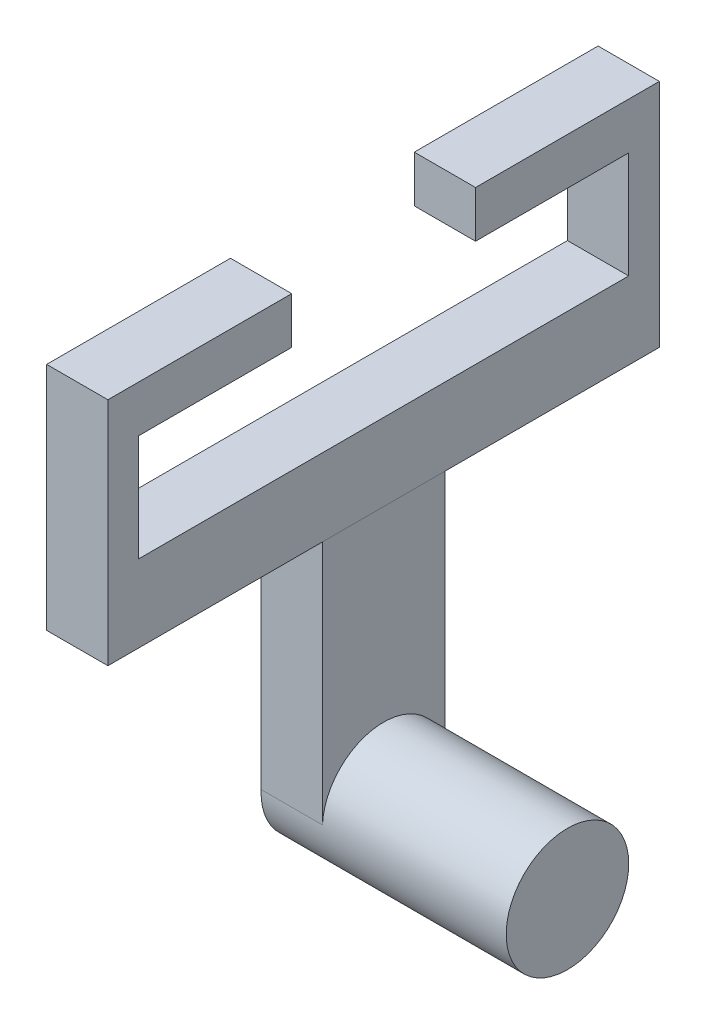
ISO-10303-21;
HEADER;
FILE_DESCRIPTION(('STEP AP214'),'2;1');
FILE_NAME('part.step','',(''),(''),'','','');
FILE_SCHEMA(('AUTOMOTIVE_DESIGN { 1 0 10303 214 1 1 1 1 }'));
ENDSEC;
DATA;
#1=APPLICATION_CONTEXT('core data for automotive mechanical design processes');
#2=APPLICATION_PROTOCOL_DEFINITION('international standard','automotive_design',2000,#1);
#3=PRODUCT_CONTEXT('',#1,'mechanical');
#4=PRODUCT('Part','Part','',(#3));
#5=PRODUCT_RELATED_PRODUCT_CATEGORY('part','',(#4));
#6=PRODUCT_DEFINITION_FORMATION('','',#4);
#7=PRODUCT_DEFINITION_CONTEXT('part definition',#1,'design');
#8=PRODUCT_DEFINITION('design','',#6,#7);
#9=PRODUCT_DEFINITION_SHAPE('','',#8);
#10=(LENGTH_UNIT() NAMED_UNIT(*) SI_UNIT(.MILLI.,.METRE.));
#11=(NAMED_UNIT(*) PLANE_ANGLE_UNIT() SI_UNIT($,.RADIAN.));
#12=(NAMED_UNIT(*) SI_UNIT($,.STERADIAN.) SOLID_ANGLE_UNIT());
#13=UNCERTAINTY_MEASURE_WITH_UNIT(LENGTH_MEASURE(1.E-05),#10,'distance_accuracy_value','');
#14=(GEOMETRIC_REPRESENTATION_CONTEXT(3) GLOBAL_UNCERTAINTY_ASSIGNED_CONTEXT((#13)) GLOBAL_UNIT_ASSIGNED_CONTEXT((#10,
#11,#12)) REPRESENTATION_CONTEXT('',''));
#15=CARTESIAN_POINT('',(0.,0.,0.));
#16=DIRECTION('',(0.,0.,1.));
#17=DIRECTION('',(1.,0.,0.));
#18=AXIS2_PLACEMENT_3D('',#15,#16,#17);
#19=CARTESIAN_POINT('',(12.7,51.3912941545788,-50.8));
#20=DIRECTION('',(0.,1.,0.));
#21=DIRECTION('',(0.,0.,1.));
#22=AXIS2_PLACEMENT_3D('',#19,#20,#21);
#23=PLANE('',#22);
#24=DIRECTION('',(0.,0.,-1.));
#25=VECTOR('',#24,1.);
#26=CARTESIAN_POINT('',(0.,51.3912941545788,-50.8));
#27=LINE('',#26,#25);
#28=CARTESIAN_POINT('',(0.,51.3912941545788,57.15));
#29=VERTEX_POINT('',#28);
#30=CARTESIAN_POINT('',(0.,51.3912941545788,-57.15));
#31=VERTEX_POINT('',#30);
#32=EDGE_CURVE('E220',#29,#31,#27,.T.);
#33=ORIENTED_EDGE('',*,*,#32,.T.);
#34=DIRECTION('',(-1.,0.,0.));
#35=VECTOR('',#34,1.);
#36=CARTESIAN_POINT('',(12.7,51.3912941545788,-57.15));
#37=LINE('',#36,#35);
#38=CARTESIAN_POINT('',(12.7,51.3912941545788,-57.15));
#39=VERTEX_POINT('',#38);
#40=EDGE_CURVE('E163',#39,#31,#37,.T.);
#41=ORIENTED_EDGE('',*,*,#40,.F.);
#42=DIRECTION('',(0.,0.,-1.));
#43=VECTOR('',#42,1.);
#44=CARTESIAN_POINT('',(12.7,51.3912941545788,-50.8));
#45=LINE('',#44,#43);
#46=CARTESIAN_POINT('',(12.7,51.3912941545788,57.15));
#47=VERTEX_POINT('',#46);
#48=EDGE_CURVE('E229',#47,#39,#45,.T.);
#49=ORIENTED_EDGE('',*,*,#48,.F.);
#50=DIRECTION('',(-1.,0.,0.));
#51=VECTOR('',#50,1.);
#52=CARTESIAN_POINT('',(12.7,51.3912941545788,57.15));
#53=LINE('',#52,#51);
#54=EDGE_CURVE('E210',#47,#29,#53,.T.);
#55=ORIENTED_EDGE('',*,*,#54,.T.);
#56=EDGE_LOOP('',(#33,#41,#49,#55));
#57=FACE_BOUND('',#56,.T.);
#58=ADVANCED_FACE('F60',(#57),#23,.F.);
#59=CARTESIAN_POINT('',(12.7,67.3932941545788,-50.8));
#60=DIRECTION('',(0.,-1.,0.));
#61=DIRECTION('',(0.,0.,-1.));
#62=AXIS2_PLACEMENT_3D('',#59,#60,#61);
#63=PLANE('',#62);
#64=DIRECTION('',(0.,0.,1.));
#65=VECTOR('',#64,1.);
#66=CARTESIAN_POINT('',(0.,67.3932941545788,-50.8));
#67=LINE('',#66,#65);
#68=CARTESIAN_POINT('',(0.,67.3932941545788,-50.8));
#69=VERTEX_POINT('',#68);
#70=CARTESIAN_POINT('',(0.,67.3932941545788,50.8));
#71=VERTEX_POINT('',#70);
#72=EDGE_CURVE('E235',#69,#71,#67,.T.);
#73=ORIENTED_EDGE('',*,*,#72,.T.);
#74=DIRECTION('',(-1.,0.,0.));
#75=VECTOR('',#74,1.);
#76=CARTESIAN_POINT('',(12.7,67.3932941545788,50.8));
#77=LINE('',#76,#75);
#78=CARTESIAN_POINT('',(12.7,67.3932941545788,50.8));
#79=VERTEX_POINT('',#78);
#80=EDGE_CURVE('E64',#79,#71,#77,.T.);
#81=ORIENTED_EDGE('',*,*,#80,.F.);
#82=DIRECTION('',(0.,0.,1.));
#83=VECTOR('',#82,1.);
#84=CARTESIAN_POINT('',(12.7,67.3932941545788,-50.8));
#85=LINE('',#84,#83);
#86=CARTESIAN_POINT('',(12.7,67.3932941545788,-50.8));
#87=VERTEX_POINT('',#86);
#88=EDGE_CURVE('E71',#87,#79,#85,.T.);
#89=ORIENTED_EDGE('',*,*,#88,.F.);
#90=DIRECTION('',(-1.,0.,0.));
#91=VECTOR('',#90,1.);
#92=CARTESIAN_POINT('',(12.7,67.3932941545788,-50.8));
#93=LINE('',#92,#91);
#94=EDGE_CURVE('E12',#87,#69,#93,.T.);
#95=ORIENTED_EDGE('',*,*,#94,.T.);
#96=EDGE_LOOP('',(#73,#81,#89,#95));
#97=FACE_BOUND('',#96,.T.);
#98=ADVANCED_FACE('F271',(#97),#63,.F.);
#99=CARTESIAN_POINT('',(12.7,0.,0.));
#100=DIRECTION('',(-1.,0.,0.));
#101=DIRECTION('',(0.,0.,1.));
#102=AXIS2_PLACEMENT_3D('',#99,#100,#101);
#103=PLANE('',#102);
#104=ORIENTED_EDGE('',*,*,#88,.T.);
#105=DIRECTION('',(0.,1.,0.));
#106=VECTOR('',#105,1.);
#107=CARTESIAN_POINT('',(12.7,51.3912941545788,50.8));
#108=LINE('',#107,#106);
#109=CARTESIAN_POINT('',(12.7,89.4912941545788,50.8));
#110=VERTEX_POINT('',#109);
#111=EDGE_CURVE('E147',#79,#110,#108,.T.);
#112=ORIENTED_EDGE('',*,*,#111,.T.);
#113=DIRECTION('',(0.,0.,-1.));
#114=VECTOR('',#113,1.);
#115=CARTESIAN_POINT('',(12.7,89.4912941545788,57.15));
#116=LINE('',#115,#114);
#117=CARTESIAN_POINT('',(12.7,89.4912941545788,19.05));
#118=VERTEX_POINT('',#117);
#119=EDGE_CURVE('E139',#110,#118,#116,.T.);
#120=ORIENTED_EDGE('',*,*,#119,.T.);
#121=DIRECTION('',(0.,1.,0.));
#122=VECTOR('',#121,1.);
#123=CARTESIAN_POINT('',(12.7,89.4912941545788,19.05));
#124=LINE('',#123,#122);
#125=CARTESIAN_POINT('',(12.7,99.1432941545788,19.05));
#126=VERTEX_POINT('',#125);
#127=EDGE_CURVE('E143',#118,#126,#124,.T.);
#128=ORIENTED_EDGE('',*,*,#127,.T.);
#129=DIRECTION('',(0.,0.,1.));
#130=VECTOR('',#129,1.);
#131=CARTESIAN_POINT('',(12.7,99.1432941545788,57.15));
#132=LINE('',#131,#130);
#133=CARTESIAN_POINT('',(12.7,99.1432941545788,57.15));
#134=VERTEX_POINT('',#133);
#135=EDGE_CURVE('E170',#126,#134,#132,.T.);
#136=ORIENTED_EDGE('',*,*,#135,.T.);
#137=DIRECTION('',(0.,-1.,0.));
#138=VECTOR('',#137,1.);
#139=CARTESIAN_POINT('',(12.7,51.3912941545788,57.15));
#140=LINE('',#139,#138);
#141=EDGE_CURVE('E203',#134,#47,#140,.T.);
#142=ORIENTED_EDGE('',*,*,#141,.T.);
#143=ORIENTED_EDGE('',*,*,#48,.T.);
#144=DIRECTION('',(0.,1.,0.));
#145=VECTOR('',#144,1.);
#146=CARTESIAN_POINT('',(12.7,51.3912941545788,-57.15));
#147=LINE('',#146,#145);
#148=CARTESIAN_POINT('',(12.7,99.1432941545788,-57.15));
#149=VERTEX_POINT('',#148);
#150=EDGE_CURVE('E223',#39,#149,#147,.T.);
#151=ORIENTED_EDGE('',*,*,#150,.T.);
#152=DIRECTION('',(0.,0.,1.));
#153=VECTOR('',#152,1.);
#154=CARTESIAN_POINT('',(12.7,99.1432941545788,-57.15));
#155=LINE('',#154,#153);
#156=CARTESIAN_POINT('',(12.7,99.1432941545788,-19.05));
#157=VERTEX_POINT('',#156);
#158=EDGE_CURVE('E193',#149,#157,#155,.T.);
#159=ORIENTED_EDGE('',*,*,#158,.T.);
#160=DIRECTION('',(0.,-1.,0.));
#161=VECTOR('',#160,1.);
#162=CARTESIAN_POINT('',(12.7,89.4912941545788,-19.05));
#163=LINE('',#162,#161);
#164=CARTESIAN_POINT('',(12.7,89.4912941545788,-19.05));
#165=VERTEX_POINT('',#164);
#166=EDGE_CURVE('E199',#157,#165,#163,.T.);
#167=ORIENTED_EDGE('',*,*,#166,.T.);
#168=DIRECTION('',(0.,0.,-1.));
#169=VECTOR('',#168,1.);
#170=CARTESIAN_POINT('',(12.7,89.4912941545788,-57.15));
#171=LINE('',#170,#169);
#172=CARTESIAN_POINT('',(12.7,89.4912941545788,-50.8));
#173=VERTEX_POINT('',#172);
#174=EDGE_CURVE('E188',#165,#173,#171,.T.);
#175=ORIENTED_EDGE('',*,*,#174,.T.);
#176=DIRECTION('',(0.,-1.,0.));
#177=VECTOR('',#176,1.);
#178=CARTESIAN_POINT('',(12.7,51.3912941545788,-50.8));
#179=LINE('',#178,#177);
#180=EDGE_CURVE('E228',#173,#87,#179,.T.);
#181=ORIENTED_EDGE('',*,*,#180,.T.);
#182=EDGE_LOOP('',(#104,#112,#120,#128,#136,#142,#143,#151,#159,#167,#175,#181));
#183=FACE_BOUND('',#182,.T.);
#184=ADVANCED_FACE('F145',(#183),#103,.F.);
#185=CARTESIAN_POINT('',(0.,0.,0.));
#186=DIRECTION('',(-1.,0.,0.));
#187=DIRECTION('',(0.,0.,1.));
#188=AXIS2_PLACEMENT_3D('',#185,#186,#187);
#189=PLANE('',#188);
#190=ORIENTED_EDGE('',*,*,#32,.F.);
#191=DIRECTION('',(0.,-1.,0.));
#192=VECTOR('',#191,1.);
#193=CARTESIAN_POINT('',(0.,51.3912941545788,57.15));
#194=LINE('',#193,#192);
#195=CARTESIAN_POINT('',(0.,99.1432941545788,57.15));
#196=VERTEX_POINT('',#195);
#197=EDGE_CURVE('E202',#196,#29,#194,.T.);
#198=ORIENTED_EDGE('',*,*,#197,.F.);
#199=DIRECTION('',(0.,0.,1.));
#200=VECTOR('',#199,1.);
#201=CARTESIAN_POINT('',(0.,99.1432941545788,57.15));
#202=LINE('',#201,#200);
#203=CARTESIAN_POINT('',(0.,99.1432941545788,19.05));
#204=VERTEX_POINT('',#203);
#205=EDGE_CURVE('E155',#204,#196,#202,.T.);
#206=ORIENTED_EDGE('',*,*,#205,.F.);
#207=DIRECTION('',(0.,1.,0.));
#208=VECTOR('',#207,1.);
#209=CARTESIAN_POINT('',(0.,89.4912941545788,19.05));
#210=LINE('',#209,#208);
#211=CARTESIAN_POINT('',(0.,89.4912941545788,19.05));
#212=VERTEX_POINT('',#211);
#213=EDGE_CURVE('E173',#212,#204,#210,.T.);
#214=ORIENTED_EDGE('',*,*,#213,.F.);
#215=DIRECTION('',(0.,0.,-1.));
#216=VECTOR('',#215,1.);
#217=CARTESIAN_POINT('',(0.,89.4912941545788,57.15));
#218=LINE('',#217,#216);
#219=CARTESIAN_POINT('',(0.,89.4912941545788,50.8));
#220=VERTEX_POINT('',#219);
#221=EDGE_CURVE('E158',#220,#212,#218,.T.);
#222=ORIENTED_EDGE('',*,*,#221,.F.);
#223=DIRECTION('',(0.,1.,0.));
#224=VECTOR('',#223,1.);
#225=CARTESIAN_POINT('',(0.,51.3912941545788,50.8));
#226=LINE('',#225,#224);
#227=EDGE_CURVE('E206',#71,#220,#226,.T.);
#228=ORIENTED_EDGE('',*,*,#227,.F.);
#229=ORIENTED_EDGE('',*,*,#72,.F.);
#230=DIRECTION('',(0.,-1.,0.));
#231=VECTOR('',#230,1.);
#232=CARTESIAN_POINT('',(0.,51.3912941545788,-50.8));
#233=LINE('',#232,#231);
#234=CARTESIAN_POINT('',(0.,89.4912941545788,-50.8));
#235=VERTEX_POINT('',#234);
#236=EDGE_CURVE('E208',#235,#69,#233,.T.);
#237=ORIENTED_EDGE('',*,*,#236,.F.);
#238=DIRECTION('',(0.,0.,-1.));
#239=VECTOR('',#238,1.);
#240=CARTESIAN_POINT('',(0.,89.4912941545788,-57.15));
#241=LINE('',#240,#239);
#242=CARTESIAN_POINT('',(0.,89.4912941545788,-19.05));
#243=VERTEX_POINT('',#242);
#244=EDGE_CURVE('E191',#243,#235,#241,.T.);
#245=ORIENTED_EDGE('',*,*,#244,.F.);
#246=DIRECTION('',(0.,-1.,0.));
#247=VECTOR('',#246,1.);
#248=CARTESIAN_POINT('',(0.,89.4912941545788,-19.05));
#249=LINE('',#248,#247);
#250=CARTESIAN_POINT('',(0.,99.1432941545788,-19.05));
#251=VERTEX_POINT('',#250);
#252=EDGE_CURVE('E192',#251,#243,#249,.T.);
#253=ORIENTED_EDGE('',*,*,#252,.F.);
#254=DIRECTION('',(0.,0.,1.));
#255=VECTOR('',#254,1.);
#256=CARTESIAN_POINT('',(0.,99.1432941545788,-57.15));
#257=LINE('',#256,#255);
#258=CARTESIAN_POINT('',(0.,99.1432941545788,-57.15));
#259=VERTEX_POINT('',#258);
#260=EDGE_CURVE('E172',#259,#251,#257,.T.);
#261=ORIENTED_EDGE('',*,*,#260,.F.);
#262=DIRECTION('',(0.,1.,0.));
#263=VECTOR('',#262,1.);
#264=CARTESIAN_POINT('',(0.,51.3912941545788,-57.15));
#265=LINE('',#264,#263);
#266=EDGE_CURVE('E222',#31,#259,#265,.T.);
#267=ORIENTED_EDGE('',*,*,#266,.F.);
#268=EDGE_LOOP('',(#190,#198,#206,#214,#222,#228,#229,#237,#245,#253,#261,#267));
#269=FACE_BOUND('',#268,.T.);
#270=ADVANCED_FACE('F245',(#269),#189,.T.);
#271=CARTESIAN_POINT('',(12.7,51.3912941545788,-50.8));
#272=DIRECTION('',(0.,0.,-1.));
#273=DIRECTION('',(-1.,0.,0.));
#274=AXIS2_PLACEMENT_3D('',#271,#272,#273);
#275=PLANE('',#274);
#276=ORIENTED_EDGE('',*,*,#94,.F.);
#277=ORIENTED_EDGE('',*,*,#180,.F.);
#278=DIRECTION('',(-1.,0.,0.));
#279=VECTOR('',#278,1.);
#280=CARTESIAN_POINT('',(12.7,89.4912941545788,-50.8));
#281=LINE('',#280,#279);
#282=EDGE_CURVE('E216',#173,#235,#281,.T.);
#283=ORIENTED_EDGE('',*,*,#282,.T.);
#284=ORIENTED_EDGE('',*,*,#236,.T.);
#285=EDGE_LOOP('',(#276,#277,#283,#284));
#286=FACE_BOUND('',#285,.T.);
#287=ADVANCED_FACE('F275',(#286),#275,.F.);
#288=CARTESIAN_POINT('',(12.7,51.3912941545788,-57.15));
#289=DIRECTION('',(0.,0.,1.));
#290=DIRECTION('',(1.,0.,0.));
#291=AXIS2_PLACEMENT_3D('',#288,#289,#290);
#292=PLANE('',#291);
#293=ORIENTED_EDGE('',*,*,#266,.T.);
#294=DIRECTION('',(-1.,0.,0.));
#295=VECTOR('',#294,1.);
#296=CARTESIAN_POINT('',(12.7,99.1432941545788,-57.15));
#297=LINE('',#296,#295);
#298=EDGE_CURVE('E181',#149,#259,#297,.T.);
#299=ORIENTED_EDGE('',*,*,#298,.F.);
#300=ORIENTED_EDGE('',*,*,#150,.F.);
#301=ORIENTED_EDGE('',*,*,#40,.T.);
#302=EDGE_LOOP('',(#293,#299,#300,#301));
#303=FACE_BOUND('',#302,.T.);
#304=ADVANCED_FACE('F260',(#303),#292,.F.);
#305=CARTESIAN_POINT('',(12.7,51.3912941545788,50.8));
#306=DIRECTION('',(0.,0.,1.));
#307=DIRECTION('',(1.,0.,0.));
#308=AXIS2_PLACEMENT_3D('',#305,#306,#307);
#309=PLANE('',#308);
#310=ORIENTED_EDGE('',*,*,#111,.F.);
#311=ORIENTED_EDGE('',*,*,#80,.T.);
#312=ORIENTED_EDGE('',*,*,#227,.T.);
#313=DIRECTION('',(-1.,0.,0.));
#314=VECTOR('',#313,1.);
#315=CARTESIAN_POINT('',(12.7,89.4912941545788,50.8));
#316=LINE('',#315,#314);
#317=EDGE_CURVE('E214',#110,#220,#316,.T.);
#318=ORIENTED_EDGE('',*,*,#317,.F.);
#319=EDGE_LOOP('',(#310,#311,#312,#318));
#320=FACE_BOUND('',#319,.T.);
#321=ADVANCED_FACE('F238',(#320),#309,.F.);
#322=CARTESIAN_POINT('',(12.7,51.3912941545788,57.15));
#323=DIRECTION('',(0.,0.,-1.));
#324=DIRECTION('',(0.,1.,0.));
#325=AXIS2_PLACEMENT_3D('',#322,#323,#324);
#326=PLANE('',#325);
#327=ORIENTED_EDGE('',*,*,#197,.T.);
#328=ORIENTED_EDGE('',*,*,#54,.F.);
#329=ORIENTED_EDGE('',*,*,#141,.F.);
#330=DIRECTION('',(-1.,0.,0.));
#331=VECTOR('',#330,1.);
#332=CARTESIAN_POINT('',(12.7,99.1432941545788,57.15));
#333=LINE('',#332,#331);
#334=EDGE_CURVE('E169',#134,#196,#333,.T.);
#335=ORIENTED_EDGE('',*,*,#334,.T.);
#336=EDGE_LOOP('',(#327,#328,#329,#335));
#337=FACE_BOUND('',#336,.T.);
#338=ADVANCED_FACE('F252',(#337),#326,.F.);
#339=CARTESIAN_POINT('',(12.7,89.4912941545788,57.15));
#340=DIRECTION('',(0.,1.,0.));
#341=DIRECTION('',(0.,0.,1.));
#342=AXIS2_PLACEMENT_3D('',#339,#340,#341);
#343=PLANE('',#342);
#344=ORIENTED_EDGE('',*,*,#119,.F.);
#345=ORIENTED_EDGE('',*,*,#317,.T.);
#346=ORIENTED_EDGE('',*,*,#221,.T.);
#347=DIRECTION('',(-1.,0.,0.));
#348=VECTOR('',#347,1.);
#349=CARTESIAN_POINT('',(12.7,89.4912941545788,19.05));
#350=LINE('',#349,#348);
#351=EDGE_CURVE('E151',#118,#212,#350,.T.);
#352=ORIENTED_EDGE('',*,*,#351,.F.);
#353=EDGE_LOOP('',(#344,#345,#346,#352));
#354=FACE_BOUND('',#353,.T.);
#355=ADVANCED_FACE('F156',(#354),#343,.F.);
#356=CARTESIAN_POINT('',(12.7,89.4912941545788,19.05));
#357=DIRECTION('',(0.,0.,1.));
#358=DIRECTION('',(1.,0.,0.));
#359=AXIS2_PLACEMENT_3D('',#356,#357,#358);
#360=PLANE('',#359);
#361=ORIENTED_EDGE('',*,*,#213,.T.);
#362=DIRECTION('',(-1.,0.,0.));
#363=VECTOR('',#362,1.);
#364=CARTESIAN_POINT('',(12.7,99.1432941545788,19.05));
#365=LINE('',#364,#363);
#366=EDGE_CURVE('E162',#126,#204,#365,.T.);
#367=ORIENTED_EDGE('',*,*,#366,.F.);
#368=ORIENTED_EDGE('',*,*,#127,.F.);
#369=ORIENTED_EDGE('',*,*,#351,.T.);
#370=EDGE_LOOP('',(#361,#367,#368,#369));
#371=FACE_BOUND('',#370,.T.);
#372=ADVANCED_FACE('F165',(#371),#360,.F.);
#373=CARTESIAN_POINT('',(12.7,99.1432941545788,57.15));
#374=DIRECTION('',(0.,-1.,0.));
#375=DIRECTION('',(0.,0.,-1.));
#376=AXIS2_PLACEMENT_3D('',#373,#374,#375);
#377=PLANE('',#376);
#378=ORIENTED_EDGE('',*,*,#205,.T.);
#379=ORIENTED_EDGE('',*,*,#334,.F.);
#380=ORIENTED_EDGE('',*,*,#135,.F.);
#381=ORIENTED_EDGE('',*,*,#366,.T.);
#382=EDGE_LOOP('',(#378,#379,#380,#381));
#383=FACE_BOUND('',#382,.T.);
#384=ADVANCED_FACE('F246',(#383),#377,.F.);
#385=CARTESIAN_POINT('',(12.7,99.1432941545788,-57.15));
#386=DIRECTION('',(0.,-1.,0.));
#387=DIRECTION('',(0.,0.,-1.));
#388=AXIS2_PLACEMENT_3D('',#385,#386,#387);
#389=PLANE('',#388);
#390=ORIENTED_EDGE('',*,*,#260,.T.);
#391=DIRECTION('',(-1.,0.,0.));
#392=VECTOR('',#391,1.);
#393=CARTESIAN_POINT('',(12.7,99.1432941545788,-19.05));
#394=LINE('',#393,#392);
#395=EDGE_CURVE('E183',#157,#251,#394,.T.);
#396=ORIENTED_EDGE('',*,*,#395,.F.);
#397=ORIENTED_EDGE('',*,*,#158,.F.);
#398=ORIENTED_EDGE('',*,*,#298,.T.);
#399=EDGE_LOOP('',(#390,#396,#397,#398));
#400=FACE_BOUND('',#399,.T.);
#401=ADVANCED_FACE('F262',(#400),#389,.F.);
#402=CARTESIAN_POINT('',(12.7,89.4912941545788,-19.05));
#403=DIRECTION('',(0.,0.,-1.));
#404=DIRECTION('',(-1.,0.,0.));
#405=AXIS2_PLACEMENT_3D('',#402,#403,#404);
#406=PLANE('',#405);
#407=ORIENTED_EDGE('',*,*,#252,.T.);
#408=DIRECTION('',(-1.,0.,0.));
#409=VECTOR('',#408,1.);
#410=CARTESIAN_POINT('',(12.7,89.4912941545788,-19.05));
#411=LINE('',#410,#409);
#412=EDGE_CURVE('E190',#165,#243,#411,.T.);
#413=ORIENTED_EDGE('',*,*,#412,.F.);
#414=ORIENTED_EDGE('',*,*,#166,.F.);
#415=ORIENTED_EDGE('',*,*,#395,.T.);
#416=EDGE_LOOP('',(#407,#413,#414,#415));
#417=FACE_BOUND('',#416,.T.);
#418=ADVANCED_FACE('F270',(#417),#406,.F.);
#419=CARTESIAN_POINT('',(12.7,89.4912941545788,-57.15));
#420=DIRECTION('',(0.,1.,0.));
#421=DIRECTION('',(0.,0.,1.));
#422=AXIS2_PLACEMENT_3D('',#419,#420,#421);
#423=PLANE('',#422);
#424=ORIENTED_EDGE('',*,*,#282,.F.);
#425=ORIENTED_EDGE('',*,*,#174,.F.);
#426=ORIENTED_EDGE('',*,*,#412,.T.);
#427=ORIENTED_EDGE('',*,*,#244,.T.);
#428=EDGE_LOOP('',(#424,#425,#426,#427));
#429=FACE_BOUND('',#428,.T.);
#430=ADVANCED_FACE('F293',(#429),#423,.F.);
#431=CLOSED_SHELL('',(#58,#98,#184,#270,#287,#304,#321,#338,#355,#372,#384,#401,#418,#430));
#432=MANIFOLD_SOLID_BREP('B2',#431);
#433=CARTESIAN_POINT('',(50.8,0.,0.));
#434=DIRECTION('',(-1.,0.,0.));
#435=DIRECTION('',(0.,0.,1.));
#436=AXIS2_PLACEMENT_3D('',#433,#434,#435);
#437=CYLINDRICAL_SURFACE('',#436,12.7);
#438=CARTESIAN_POINT('',(50.8,0.,0.));
#439=DIRECTION('',(1.,0.,0.));
#440=DIRECTION('',(0.,0.,-1.));
#441=AXIS2_PLACEMENT_3D('',#438,#439,#440);
#442=CIRCLE('',#441,12.7);
#443=CARTESIAN_POINT('',(50.8,0.,-12.7));
#444=VERTEX_POINT('',#443);
#445=EDGE_CURVE('E433',#444,#444,#442,.T.);
#446=ORIENTED_EDGE('',*,*,#445,.F.);
#447=EDGE_LOOP('',(#446));
#448=FACE_BOUND('',#447,.T.);
#449=CARTESIAN_POINT('',(12.7,0.,0.));
#450=DIRECTION('',(1.,0.,0.));
#451=DIRECTION('',(0.,0.,-1.));
#452=AXIS2_PLACEMENT_3D('',#449,#450,#451);
#453=CIRCLE('',#452,12.7);
#454=CARTESIAN_POINT('',(12.7,0.60873287463422,-12.6854028035116));
#455=VERTEX_POINT('',#454);
#456=CARTESIAN_POINT('',(12.7,0.60873287463422,12.6854028035116));
#457=VERTEX_POINT('',#456);
#458=EDGE_CURVE('E54',#455,#457,#453,.T.);
#459=ORIENTED_EDGE('',*,*,#458,.T.);
#460=DIRECTION('',(-1.,0.,0.));
#461=VECTOR('',#460,1.);
#462=CARTESIAN_POINT('',(50.8,0.60873287463422,12.6854028035116));
#463=LINE('',#462,#461);
#464=CARTESIAN_POINT('',(0.,0.60873287463422,12.6854028035116));
#465=VERTEX_POINT('',#464);
#466=EDGE_CURVE('E501',#457,#465,#463,.T.);
#467=ORIENTED_EDGE('',*,*,#466,.T.);
#468=CARTESIAN_POINT('',(0.,0.,0.));
#469=DIRECTION('',(1.,0.,0.));
#470=DIRECTION('',(0.,0.,-1.));
#471=AXIS2_PLACEMENT_3D('',#468,#469,#470);
#472=CIRCLE('',#471,12.7);
#473=CARTESIAN_POINT('',(0.,0.60873287463422,-12.6854028035116));
#474=VERTEX_POINT('',#473);
#475=EDGE_CURVE('E486',#465,#474,#472,.T.);
#476=ORIENTED_EDGE('',*,*,#475,.T.);
#477=DIRECTION('',(-1.,0.,0.));
#478=VECTOR('',#477,1.);
#479=CARTESIAN_POINT('',(12.7,0.60873287463422,-12.6854028035116));
#480=LINE('',#479,#478);
#481=EDGE_CURVE('E476',#455,#474,#480,.T.);
#482=ORIENTED_EDGE('',*,*,#481,.F.);
#483=EDGE_LOOP('',(#459,#467,#476,#482));
#484=FACE_BOUND('',#483,.T.);
#485=ADVANCED_FACE('F424',(#448,#484),#437,.T.);
#486=CARTESIAN_POINT('',(50.8,0.,0.));
#487=DIRECTION('',(1.,0.,0.));
#488=DIRECTION('',(0.,0.,-1.));
#489=AXIS2_PLACEMENT_3D('',#486,#487,#488);
#490=PLANE('',#489);
#491=ORIENTED_EDGE('',*,*,#445,.T.);
#492=EDGE_LOOP('',(#491));
#493=FACE_BOUND('',#492,.T.);
#494=ADVANCED_FACE('F537',(#493),#490,.T.);
#495=CARTESIAN_POINT('',(0.,0.,0.));
#496=DIRECTION('',(1.,0.,0.));
#497=DIRECTION('',(0.,0.,-1.));
#498=AXIS2_PLACEMENT_3D('',#495,#496,#497);
#499=PLANE('',#498);
#500=ORIENTED_EDGE('',*,*,#475,.F.);
#501=DIRECTION('',(0.,0.,1.));
#502=VECTOR('',#501,1.);
#503=CARTESIAN_POINT('',(0.,0.60873287463422,-12.6854028035116));
#504=LINE('',#503,#502);
#505=CARTESIAN_POINT('',(0.,0.60873287463422,12.7145971964884));
#506=VERTEX_POINT('',#505);
#507=EDGE_CURVE('E450',#465,#506,#504,.T.);
#508=ORIENTED_EDGE('',*,*,#507,.T.);
#509=DIRECTION('',(0.,1.,0.));
#510=VECTOR('',#509,1.);
#511=CARTESIAN_POINT('',(0.,0.60873287463422,12.7145971964884));
#512=LINE('',#511,#510);
#513=CARTESIAN_POINT('',(0.,51.4087328746342,12.7145971964884));
#514=VERTEX_POINT('',#513);
#515=EDGE_CURVE('E517',#506,#514,#512,.T.);
#516=ORIENTED_EDGE('',*,*,#515,.T.);
#517=DIRECTION('',(0.,0.,-1.));
#518=VECTOR('',#517,1.);
#519=CARTESIAN_POINT('',(0.,51.4087328746342,-12.6854028035116));
#520=LINE('',#519,#518);
#521=CARTESIAN_POINT('',(0.,51.4087328746342,-12.6854028035116));
#522=VERTEX_POINT('',#521);
#523=EDGE_CURVE('E482',#514,#522,#520,.T.);
#524=ORIENTED_EDGE('',*,*,#523,.T.);
#525=DIRECTION('',(0.,-1.,0.));
#526=VECTOR('',#525,1.);
#527=CARTESIAN_POINT('',(0.,0.60873287463422,-12.6854028035116));
#528=LINE('',#527,#526);
#529=EDGE_CURVE('E523',#522,#474,#528,.T.);
#530=ORIENTED_EDGE('',*,*,#529,.T.);
#531=EDGE_LOOP('',(#500,#508,#516,#524,#530));
#532=FACE_BOUND('',#531,.T.);
#533=ADVANCED_FACE('F536',(#532),#499,.F.);
#534=CARTESIAN_POINT('',(12.7,0.60873287463422,-12.6854028035116));
#535=DIRECTION('',(0.,-1.,0.));
#536=DIRECTION('',(0.,0.,-1.));
#537=AXIS2_PLACEMENT_3D('',#534,#535,#536);
#538=PLANE('',#537);
#539=ORIENTED_EDGE('',*,*,#466,.F.);
#540=DIRECTION('',(0.,0.,1.));
#541=VECTOR('',#540,1.);
#542=CARTESIAN_POINT('',(12.7,0.60873287463422,-12.6854028035116));
#543=LINE('',#542,#541);
#544=CARTESIAN_POINT('',(12.7,0.60873287463422,12.7145971964884));
#545=VERTEX_POINT('',#544);
#546=EDGE_CURVE('E439',#457,#545,#543,.T.);
#547=ORIENTED_EDGE('',*,*,#546,.T.);
#548=DIRECTION('',(-1.,0.,0.));
#549=VECTOR('',#548,1.);
#550=CARTESIAN_POINT('',(12.7,0.60873287463422,12.7145971964884));
#551=LINE('',#550,#549);
#552=EDGE_CURVE('E489',#545,#506,#551,.T.);
#553=ORIENTED_EDGE('',*,*,#552,.T.);
#554=ORIENTED_EDGE('',*,*,#507,.F.);
#555=EDGE_LOOP('',(#539,#547,#553,#554));
#556=FACE_BOUND('',#555,.T.);
#557=ADVANCED_FACE('F529',(#556),#538,.T.);
#558=CARTESIAN_POINT('',(12.7,0.60873287463422,-12.6854028035116));
#559=DIRECTION('',(0.,0.,-1.));
#560=DIRECTION('',(-1.,0.,0.));
#561=AXIS2_PLACEMENT_3D('',#558,#559,#560);
#562=PLANE('',#561);
#563=ORIENTED_EDGE('',*,*,#529,.F.);
#564=DIRECTION('',(-1.,0.,0.));
#565=VECTOR('',#564,1.);
#566=CARTESIAN_POINT('',(12.7,51.4087328746342,-12.6854028035116));
#567=LINE('',#566,#565);
#568=CARTESIAN_POINT('',(12.7,51.4087328746342,-12.6854028035116));
#569=VERTEX_POINT('',#568);
#570=EDGE_CURVE('E485',#569,#522,#567,.T.);
#571=ORIENTED_EDGE('',*,*,#570,.F.);
#572=DIRECTION('',(0.,-1.,0.));
#573=VECTOR('',#572,1.);
#574=CARTESIAN_POINT('',(12.7,0.60873287463422,-12.6854028035116));
#575=LINE('',#574,#573);
#576=EDGE_CURVE('E472',#569,#455,#575,.T.);
#577=ORIENTED_EDGE('',*,*,#576,.T.);
#578=ORIENTED_EDGE('',*,*,#481,.T.);
#579=EDGE_LOOP('',(#563,#571,#577,#578));
#580=FACE_BOUND('',#579,.T.);
#581=ADVANCED_FACE('F479',(#580),#562,.T.);
#582=CARTESIAN_POINT('',(12.7,51.4087328746342,-12.6854028035116));
#583=DIRECTION('',(0.,1.,0.));
#584=DIRECTION('',(0.,0.,1.));
#585=AXIS2_PLACEMENT_3D('',#582,#583,#584);
#586=PLANE('',#585);
#587=ORIENTED_EDGE('',*,*,#523,.F.);
#588=DIRECTION('',(-1.,0.,0.));
#589=VECTOR('',#588,1.);
#590=CARTESIAN_POINT('',(12.7,51.4087328746342,12.7145971964884));
#591=LINE('',#590,#589);
#592=CARTESIAN_POINT('',(12.7,51.4087328746342,12.7145971964884));
#593=VERTEX_POINT('',#592);
#594=EDGE_CURVE('E492',#593,#514,#591,.T.);
#595=ORIENTED_EDGE('',*,*,#594,.F.);
#596=DIRECTION('',(0.,0.,-1.));
#597=VECTOR('',#596,1.);
#598=CARTESIAN_POINT('',(12.7,51.4087328746342,-12.6854028035116));
#599=LINE('',#598,#597);
#600=EDGE_CURVE('E493',#593,#569,#599,.T.);
#601=ORIENTED_EDGE('',*,*,#600,.T.);
#602=ORIENTED_EDGE('',*,*,#570,.T.);
#603=EDGE_LOOP('',(#587,#595,#601,#602));
#604=FACE_BOUND('',#603,.T.);
#605=ADVANCED_FACE('F534',(#604),#586,.T.);
#606=CARTESIAN_POINT('',(12.7,0.60873287463422,12.7145971964884));
#607=DIRECTION('',(0.,0.,1.));
#608=DIRECTION('',(1.,0.,0.));
#609=AXIS2_PLACEMENT_3D('',#606,#607,#608);
#610=PLANE('',#609);
#611=ORIENTED_EDGE('',*,*,#515,.F.);
#612=ORIENTED_EDGE('',*,*,#552,.F.);
#613=DIRECTION('',(0.,1.,0.));
#614=VECTOR('',#613,1.);
#615=CARTESIAN_POINT('',(12.7,0.60873287463422,12.7145971964884));
#616=LINE('',#615,#614);
#617=EDGE_CURVE('E500',#545,#593,#616,.T.);
#618=ORIENTED_EDGE('',*,*,#617,.T.);
#619=ORIENTED_EDGE('',*,*,#594,.T.);
#620=EDGE_LOOP('',(#611,#612,#618,#619));
#621=FACE_BOUND('',#620,.T.);
#622=ADVANCED_FACE('F532',(#621),#610,.T.);
#623=CARTESIAN_POINT('',(12.7,0.,0.));
#624=DIRECTION('',(1.,0.,0.));
#625=DIRECTION('',(0.,0.,-1.));
#626=AXIS2_PLACEMENT_3D('',#623,#624,#625);
#627=PLANE('',#626);
#628=ORIENTED_EDGE('',*,*,#458,.F.);
#629=ORIENTED_EDGE('',*,*,#576,.F.);
#630=ORIENTED_EDGE('',*,*,#600,.F.);
#631=ORIENTED_EDGE('',*,*,#617,.F.);
#632=ORIENTED_EDGE('',*,*,#546,.F.);
#633=EDGE_LOOP('',(#628,#629,#630,#631,#632));
#634=FACE_BOUND('',#633,.T.);
#635=ADVANCED_FACE('F471',(#634),#627,.T.);
#636=CLOSED_SHELL('',(#485,#494,#533,#557,#581,#605,#622,#635));
#637=MANIFOLD_SOLID_BREP('B6',#636);
#638=ADVANCED_BREP_SHAPE_REPRESENTATION('',(#18,#432,#637),#14);
#639=SHAPE_DEFINITION_REPRESENTATION(#9,#638);
ENDSEC;
END-ISO-10303-21;
